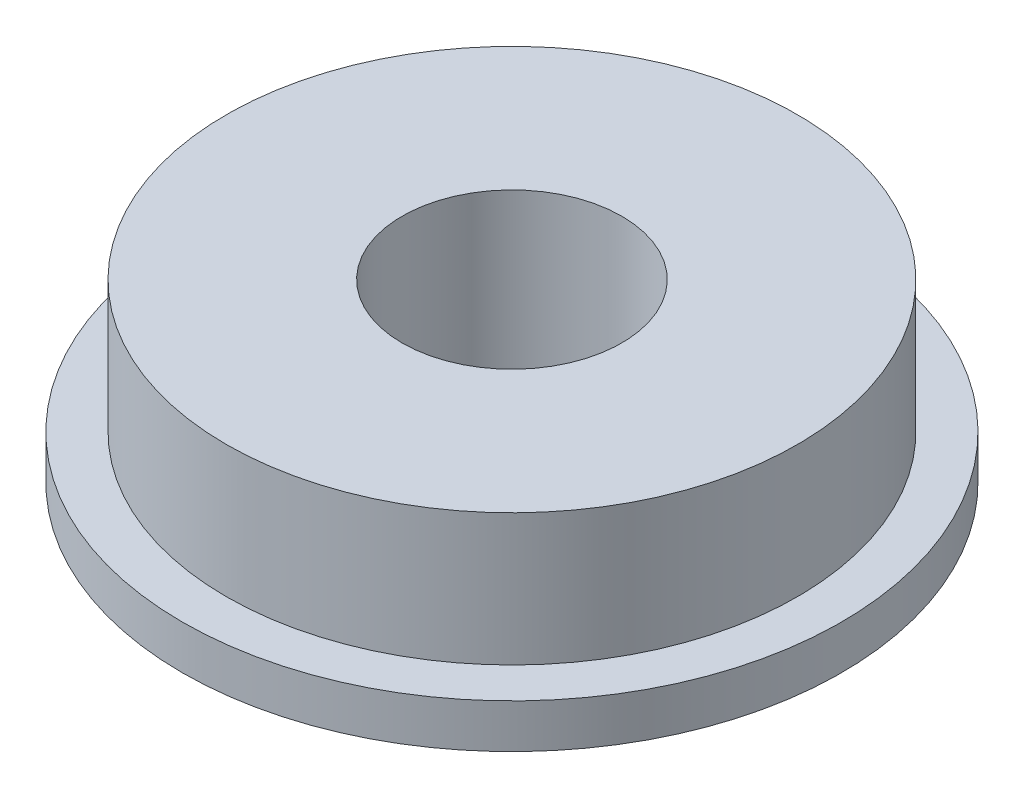
ISO-10303-21;
HEADER;
FILE_DESCRIPTION(('STEP AP214'),'2;1');
FILE_NAME('part.step','',(''),(''),'','','');
FILE_SCHEMA(('AUTOMOTIVE_DESIGN { 1 0 10303 214 1 1 1 1 }'));
ENDSEC;
DATA;
#1=APPLICATION_CONTEXT('core data for automotive mechanical design processes');
#2=APPLICATION_PROTOCOL_DEFINITION('international standard','automotive_design',2000,#1);
#3=PRODUCT_CONTEXT('',#1,'mechanical');
#4=PRODUCT('Part','Part','',(#3));
#5=PRODUCT_RELATED_PRODUCT_CATEGORY('part','',(#4));
#6=PRODUCT_DEFINITION_FORMATION('','',#4);
#7=PRODUCT_DEFINITION_CONTEXT('part definition',#1,'design');
#8=PRODUCT_DEFINITION('design','',#6,#7);
#9=PRODUCT_DEFINITION_SHAPE('','',#8);
#10=(LENGTH_UNIT() NAMED_UNIT(*) SI_UNIT(.MILLI.,.METRE.));
#11=(NAMED_UNIT(*) PLANE_ANGLE_UNIT() SI_UNIT($,.RADIAN.));
#12=(NAMED_UNIT(*) SI_UNIT($,.STERADIAN.) SOLID_ANGLE_UNIT());
#13=UNCERTAINTY_MEASURE_WITH_UNIT(LENGTH_MEASURE(1.E-05),#10,'distance_accuracy_value','');
#14=(GEOMETRIC_REPRESENTATION_CONTEXT(3) GLOBAL_UNCERTAINTY_ASSIGNED_CONTEXT((#13)) GLOBAL_UNIT_ASSIGNED_CONTEXT((#10,
#11,#12)) REPRESENTATION_CONTEXT('',''));
#15=CARTESIAN_POINT('',(0.,0.,0.));
#16=DIRECTION('',(0.,0.,1.));
#17=DIRECTION('',(1.,0.,0.));
#18=AXIS2_PLACEMENT_3D('',#15,#16,#17);
#19=CARTESIAN_POINT('',(0.,1.,0.));
#20=DIRECTION('',(0.,-1.,0.));
#21=DIRECTION('',(0.,0.,-1.));
#22=AXIS2_PLACEMENT_3D('',#19,#20,#21);
#23=CYLINDRICAL_SURFACE('',#22,2.5);
#24=CARTESIAN_POINT('',(0.,0.,0.));
#25=DIRECTION('',(0.,1.,0.));
#26=DIRECTION('',(0.,0.,1.));
#27=AXIS2_PLACEMENT_3D('',#24,#25,#26);
#28=CIRCLE('',#27,2.5);
#29=CARTESIAN_POINT('',(0.,0.,2.5));
#30=VERTEX_POINT('',#29);
#31=EDGE_CURVE('E65',#30,#30,#28,.T.);
#32=ORIENTED_EDGE('',*,*,#31,.F.);
#33=EDGE_LOOP('',(#32));
#34=FACE_BOUND('',#33,.T.);
#35=CARTESIAN_POINT('',(0.,4.,0.));
#36=DIRECTION('',(0.,1.,0.));
#37=DIRECTION('',(0.,0.,1.));
#38=AXIS2_PLACEMENT_3D('',#35,#36,#37);
#39=CIRCLE('',#38,2.5);
#40=CARTESIAN_POINT('',(0.,4.,2.5));
#41=VERTEX_POINT('',#40);
#42=EDGE_CURVE('E74',#41,#41,#39,.T.);
#43=ORIENTED_EDGE('',*,*,#42,.T.);
#44=EDGE_LOOP('',(#43));
#45=FACE_BOUND('',#44,.T.);
#46=ADVANCED_FACE('F47',(#34,#45),#23,.F.);
#47=CARTESIAN_POINT('',(0.,1.,0.));
#48=DIRECTION('',(0.,-1.,0.));
#49=DIRECTION('',(0.,0.,-1.));
#50=AXIS2_PLACEMENT_3D('',#47,#48,#49);
#51=CYLINDRICAL_SURFACE('',#50,7.5);
#52=CARTESIAN_POINT('',(0.,1.,0.));
#53=DIRECTION('',(0.,1.,0.));
#54=DIRECTION('',(0.,0.,1.));
#55=AXIS2_PLACEMENT_3D('',#52,#53,#54);
#56=CIRCLE('',#55,7.5);
#57=CARTESIAN_POINT('',(0.,1.,7.5));
#58=VERTEX_POINT('',#57);
#59=EDGE_CURVE('E55',#58,#58,#56,.T.);
#60=ORIENTED_EDGE('',*,*,#59,.F.);
#61=EDGE_LOOP('',(#60));
#62=FACE_BOUND('',#61,.T.);
#63=CARTESIAN_POINT('',(0.,0.,0.));
#64=DIRECTION('',(0.,1.,0.));
#65=DIRECTION('',(0.,0.,1.));
#66=AXIS2_PLACEMENT_3D('',#63,#64,#65);
#67=CIRCLE('',#66,7.5);
#68=CARTESIAN_POINT('',(0.,0.,7.5));
#69=VERTEX_POINT('',#68);
#70=EDGE_CURVE('E50',#69,#69,#67,.T.);
#71=ORIENTED_EDGE('',*,*,#70,.T.);
#72=EDGE_LOOP('',(#71));
#73=FACE_BOUND('',#72,.T.);
#74=ADVANCED_FACE('F96',(#62,#73),#51,.T.);
#75=CARTESIAN_POINT('',(0.,1.,0.));
#76=DIRECTION('',(0.,1.,0.));
#77=DIRECTION('',(0.,0.,1.));
#78=AXIS2_PLACEMENT_3D('',#75,#76,#77);
#79=PLANE('',#78);
#80=CARTESIAN_POINT('',(0.,1.,0.));
#81=DIRECTION('',(0.,1.,0.));
#82=DIRECTION('',(0.,0.,1.));
#83=AXIS2_PLACEMENT_3D('',#80,#81,#82);
#84=CIRCLE('',#83,6.5);
#85=CARTESIAN_POINT('',(0.,1.,6.5));
#86=VERTEX_POINT('',#85);
#87=EDGE_CURVE('E11',#86,#86,#84,.T.);
#88=ORIENTED_EDGE('',*,*,#87,.F.);
#89=EDGE_LOOP('',(#88));
#90=FACE_BOUND('',#89,.T.);
#91=ORIENTED_EDGE('',*,*,#59,.T.);
#92=EDGE_LOOP('',(#91));
#93=FACE_BOUND('',#92,.T.);
#94=ADVANCED_FACE('F93',(#90,#93),#79,.T.);
#95=CARTESIAN_POINT('',(0.,0.,0.));
#96=DIRECTION('',(0.,1.,0.));
#97=DIRECTION('',(0.,0.,1.));
#98=AXIS2_PLACEMENT_3D('',#95,#96,#97);
#99=PLANE('',#98);
#100=ORIENTED_EDGE('',*,*,#31,.T.);
#101=EDGE_LOOP('',(#100));
#102=FACE_BOUND('',#101,.T.);
#103=ORIENTED_EDGE('',*,*,#70,.F.);
#104=EDGE_LOOP('',(#103));
#105=FACE_BOUND('',#104,.T.);
#106=ADVANCED_FACE('F85',(#102,#105),#99,.F.);
#107=CARTESIAN_POINT('',(0.,4.,0.));
#108=DIRECTION('',(0.,1.,0.));
#109=DIRECTION('',(0.,0.,1.));
#110=AXIS2_PLACEMENT_3D('',#107,#108,#109);
#111=PLANE('',#110);
#112=CARTESIAN_POINT('',(0.,4.,0.));
#113=DIRECTION('',(0.,1.,0.));
#114=DIRECTION('',(0.,0.,1.));
#115=AXIS2_PLACEMENT_3D('',#112,#113,#114);
#116=CIRCLE('',#115,6.5);
#117=CARTESIAN_POINT('',(0.,4.,6.5));
#118=VERTEX_POINT('',#117);
#119=EDGE_CURVE('E63',#118,#118,#116,.T.);
#120=ORIENTED_EDGE('',*,*,#119,.T.);
#121=EDGE_LOOP('',(#120));
#122=FACE_BOUND('',#121,.T.);
#123=ORIENTED_EDGE('',*,*,#42,.F.);
#124=EDGE_LOOP('',(#123));
#125=FACE_BOUND('',#124,.T.);
#126=ADVANCED_FACE('F82',(#122,#125),#111,.T.);
#127=CARTESIAN_POINT('',(0.,4.,0.));
#128=DIRECTION('',(0.,-1.,0.));
#129=DIRECTION('',(0.,0.,-1.));
#130=AXIS2_PLACEMENT_3D('',#127,#128,#129);
#131=CYLINDRICAL_SURFACE('',#130,6.5);
#132=ORIENTED_EDGE('',*,*,#119,.F.);
#133=EDGE_LOOP('',(#132));
#134=FACE_BOUND('',#133,.T.);
#135=ORIENTED_EDGE('',*,*,#87,.T.);
#136=EDGE_LOOP('',(#135));
#137=FACE_BOUND('',#136,.T.);
#138=ADVANCED_FACE('F84',(#134,#137),#131,.T.);
#139=CLOSED_SHELL('',(#46,#74,#94,#106,#126,#138));
#140=MANIFOLD_SOLID_BREP('B2',#139);
#141=ADVANCED_BREP_SHAPE_REPRESENTATION('',(#18,#140),#14);
#142=SHAPE_DEFINITION_REPRESENTATION(#9,#141);
ENDSEC;
END-ISO-10303-21;
